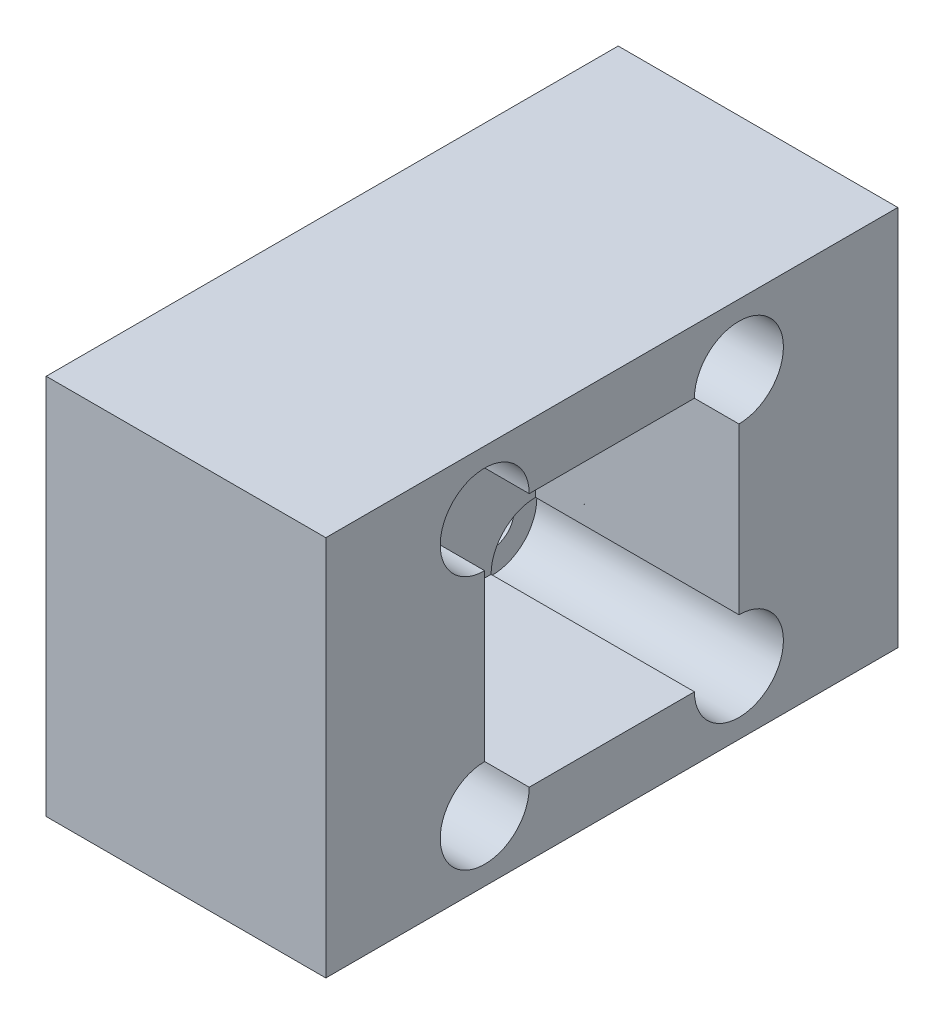
ISO-10303-21;
HEADER;
FILE_DESCRIPTION(('STEP AP214'),'2;1');
FILE_NAME('part.step','',(''),(''),'','','');
FILE_SCHEMA(('AUTOMOTIVE_DESIGN { 1 0 10303 214 1 1 1 1 }'));
ENDSEC;
DATA;
#1=APPLICATION_CONTEXT('core data for automotive mechanical design processes');
#2=APPLICATION_PROTOCOL_DEFINITION('international standard','automotive_design',2000,#1);
#3=PRODUCT_CONTEXT('',#1,'mechanical');
#4=PRODUCT('Part','Part','',(#3));
#5=PRODUCT_RELATED_PRODUCT_CATEGORY('part','',(#4));
#6=PRODUCT_DEFINITION_FORMATION('','',#4);
#7=PRODUCT_DEFINITION_CONTEXT('part definition',#1,'design');
#8=PRODUCT_DEFINITION('design','',#6,#7);
#9=PRODUCT_DEFINITION_SHAPE('','',#8);
#10=(LENGTH_UNIT() NAMED_UNIT(*) SI_UNIT(.MILLI.,.METRE.));
#11=(NAMED_UNIT(*) PLANE_ANGLE_UNIT() SI_UNIT($,.RADIAN.));
#12=(NAMED_UNIT(*) SI_UNIT($,.STERADIAN.) SOLID_ANGLE_UNIT());
#13=UNCERTAINTY_MEASURE_WITH_UNIT(LENGTH_MEASURE(1.E-05),#10,'distance_accuracy_value','');
#14=(GEOMETRIC_REPRESENTATION_CONTEXT(3) GLOBAL_UNCERTAINTY_ASSIGNED_CONTEXT((#13)) GLOBAL_UNIT_ASSIGNED_CONTEXT((#10,
#11,#12)) REPRESENTATION_CONTEXT('',''));
#15=CARTESIAN_POINT('',(0.,0.,0.));
#16=DIRECTION('',(0.,0.,1.));
#17=DIRECTION('',(1.,0.,0.));
#18=AXIS2_PLACEMENT_3D('',#15,#16,#17);
#19=CARTESIAN_POINT('',(22.,0.,0.));
#20=DIRECTION('',(-1.,0.,0.));
#21=DIRECTION('',(0.,0.,1.));
#22=AXIS2_PLACEMENT_3D('',#19,#20,#21);
#23=PLANE('',#22);
#24=DIRECTION('',(0.,-1.,0.));
#25=VECTOR('',#24,1.);
#26=CARTESIAN_POINT('',(22.,0.,0.));
#27=LINE('',#26,#25);
#28=CARTESIAN_POINT('',(22.,30.,0.));
#29=VERTEX_POINT('',#28);
#30=CARTESIAN_POINT('',(22.,0.,0.));
#31=VERTEX_POINT('',#30);
#32=EDGE_CURVE('E153',#29,#31,#27,.T.);
#33=ORIENTED_EDGE('',*,*,#32,.T.);
#34=DIRECTION('',(0.,0.,-1.));
#35=VECTOR('',#34,1.);
#36=CARTESIAN_POINT('',(22.,0.,0.));
#37=LINE('',#36,#35);
#38=CARTESIAN_POINT('',(22.,0.,-45.));
#39=VERTEX_POINT('',#38);
#40=EDGE_CURVE('E156',#31,#39,#37,.T.);
#41=ORIENTED_EDGE('',*,*,#40,.T.);
#42=DIRECTION('',(0.,1.,0.));
#43=VECTOR('',#42,1.);
#44=CARTESIAN_POINT('',(22.,0.,-45.));
#45=LINE('',#44,#43);
#46=CARTESIAN_POINT('',(22.,30.,-45.));
#47=VERTEX_POINT('',#46);
#48=EDGE_CURVE('E159',#39,#47,#45,.T.);
#49=ORIENTED_EDGE('',*,*,#48,.T.);
#50=DIRECTION('',(0.,0.,1.));
#51=VECTOR('',#50,1.);
#52=CARTESIAN_POINT('',(22.,30.,0.));
#53=LINE('',#52,#51);
#54=EDGE_CURVE('E161',#47,#29,#53,.T.);
#55=ORIENTED_EDGE('',*,*,#54,.T.);
#56=EDGE_LOOP('',(#33,#41,#49,#55));
#57=FACE_BOUND('',#56,.T.);
#58=CARTESIAN_POINT('',(22.,25.,-12.5));
#59=DIRECTION('',(1.,0.,0.));
#60=DIRECTION('',(0.,0.,-1.));
#61=AXIS2_PLACEMENT_3D('',#58,#59,#60);
#62=CIRCLE('',#61,3.5);
#63=CARTESIAN_POINT('',(22.,25.,-16.));
#64=VERTEX_POINT('',#63);
#65=CARTESIAN_POINT('',(22.,21.5,-12.5));
#66=VERTEX_POINT('',#65);
#67=EDGE_CURVE('E126',#64,#66,#62,.T.);
#68=ORIENTED_EDGE('',*,*,#67,.F.);
#69=DIRECTION('',(0.,0.,1.));
#70=VECTOR('',#69,1.);
#71=CARTESIAN_POINT('',(22.,25.,-12.5));
#72=LINE('',#71,#70);
#73=CARTESIAN_POINT('',(22.,25.,-29.));
#74=VERTEX_POINT('',#73);
#75=EDGE_CURVE('E137',#74,#64,#72,.T.);
#76=ORIENTED_EDGE('',*,*,#75,.F.);
#77=CARTESIAN_POINT('',(22.,25.,-32.5));
#78=DIRECTION('',(1.,0.,0.));
#79=DIRECTION('',(0.,0.,-1.));
#80=AXIS2_PLACEMENT_3D('',#77,#78,#79);
#81=CIRCLE('',#80,3.5);
#82=CARTESIAN_POINT('',(22.,21.5,-32.5));
#83=VERTEX_POINT('',#82);
#84=EDGE_CURVE('E470',#83,#74,#81,.T.);
#85=ORIENTED_EDGE('',*,*,#84,.F.);
#86=DIRECTION('',(0.,1.,0.));
#87=VECTOR('',#86,1.);
#88=CARTESIAN_POINT('',(22.,25.,-32.5));
#89=LINE('',#88,#87);
#90=CARTESIAN_POINT('',(22.,8.49999999999999,-32.5));
#91=VERTEX_POINT('',#90);
#92=EDGE_CURVE('E144',#91,#83,#89,.T.);
#93=ORIENTED_EDGE('',*,*,#92,.F.);
#94=CARTESIAN_POINT('',(22.,5.,-32.5));
#95=DIRECTION('',(1.,0.,0.));
#96=DIRECTION('',(0.,0.,-1.));
#97=AXIS2_PLACEMENT_3D('',#94,#95,#96);
#98=CIRCLE('',#97,3.5);
#99=CARTESIAN_POINT('',(22.,5.,-29.));
#100=VERTEX_POINT('',#99);
#101=EDGE_CURVE('E220',#100,#91,#98,.T.);
#102=ORIENTED_EDGE('',*,*,#101,.F.);
#103=DIRECTION('',(0.,0.,-1.));
#104=VECTOR('',#103,1.);
#105=CARTESIAN_POINT('',(22.,5.,-12.5));
#106=LINE('',#105,#104);
#107=CARTESIAN_POINT('',(22.,5.,-16.));
#108=VERTEX_POINT('',#107);
#109=EDGE_CURVE('E149',#108,#100,#106,.T.);
#110=ORIENTED_EDGE('',*,*,#109,.F.);
#111=CARTESIAN_POINT('',(22.,5.,-12.5));
#112=DIRECTION('',(1.,0.,0.));
#113=DIRECTION('',(0.,0.,-1.));
#114=AXIS2_PLACEMENT_3D('',#111,#112,#113);
#115=CIRCLE('',#114,3.5);
#116=CARTESIAN_POINT('',(22.,8.49999999999999,-12.5));
#117=VERTEX_POINT('',#116);
#118=EDGE_CURVE('E219',#117,#108,#115,.T.);
#119=ORIENTED_EDGE('',*,*,#118,.F.);
#120=DIRECTION('',(0.,-1.,0.));
#121=VECTOR('',#120,1.);
#122=CARTESIAN_POINT('',(22.,25.,-12.5));
#123=LINE('',#122,#121);
#124=EDGE_CURVE('E139',#66,#117,#123,.T.);
#125=ORIENTED_EDGE('',*,*,#124,.F.);
#126=EDGE_LOOP('',(#68,#76,#85,#93,#102,#110,#119,#125));
#127=FACE_BOUND('',#126,.T.);
#128=ADVANCED_FACE('F37',(#57,#127),#23,.F.);
#129=CARTESIAN_POINT('',(22.,0.,0.));
#130=DIRECTION('',(0.,0.,-1.));
#131=DIRECTION('',(0.,1.,0.));
#132=AXIS2_PLACEMENT_3D('',#129,#130,#131);
#133=PLANE('',#132);
#134=DIRECTION('',(0.,-1.,0.));
#135=VECTOR('',#134,1.);
#136=CARTESIAN_POINT('',(0.,0.,0.));
#137=LINE('',#136,#135);
#138=CARTESIAN_POINT('',(0.,30.,0.));
#139=VERTEX_POINT('',#138);
#140=CARTESIAN_POINT('',(0.,0.,0.));
#141=VERTEX_POINT('',#140);
#142=EDGE_CURVE('E164',#139,#141,#137,.T.);
#143=ORIENTED_EDGE('',*,*,#142,.T.);
#144=DIRECTION('',(-1.,0.,0.));
#145=VECTOR('',#144,1.);
#146=CARTESIAN_POINT('',(22.,0.,0.));
#147=LINE('',#146,#145);
#148=EDGE_CURVE('E181',#31,#141,#147,.T.);
#149=ORIENTED_EDGE('',*,*,#148,.F.);
#150=ORIENTED_EDGE('',*,*,#32,.F.);
#151=DIRECTION('',(-1.,0.,0.));
#152=VECTOR('',#151,1.);
#153=CARTESIAN_POINT('',(22.,30.,0.));
#154=LINE('',#153,#152);
#155=EDGE_CURVE('E163',#29,#139,#154,.T.);
#156=ORIENTED_EDGE('',*,*,#155,.T.);
#157=EDGE_LOOP('',(#143,#149,#150,#156));
#158=FACE_BOUND('',#157,.T.);
#159=ADVANCED_FACE('F39',(#158),#133,.F.);
#160=CARTESIAN_POINT('',(22.,0.,0.));
#161=DIRECTION('',(0.,1.,0.));
#162=DIRECTION('',(0.,0.,1.));
#163=AXIS2_PLACEMENT_3D('',#160,#161,#162);
#164=PLANE('',#163);
#165=DIRECTION('',(0.,0.,-1.));
#166=VECTOR('',#165,1.);
#167=CARTESIAN_POINT('',(0.,0.,0.));
#168=LINE('',#167,#166);
#169=CARTESIAN_POINT('',(0.,0.,-45.));
#170=VERTEX_POINT('',#169);
#171=EDGE_CURVE('E167',#141,#170,#168,.T.);
#172=ORIENTED_EDGE('',*,*,#171,.T.);
#173=DIRECTION('',(-1.,0.,0.));
#174=VECTOR('',#173,1.);
#175=CARTESIAN_POINT('',(22.,0.,-45.));
#176=LINE('',#175,#174);
#177=EDGE_CURVE('E178',#39,#170,#176,.T.);
#178=ORIENTED_EDGE('',*,*,#177,.F.);
#179=ORIENTED_EDGE('',*,*,#40,.F.);
#180=ORIENTED_EDGE('',*,*,#148,.T.);
#181=EDGE_LOOP('',(#172,#178,#179,#180));
#182=FACE_BOUND('',#181,.T.);
#183=ADVANCED_FACE('F277',(#182),#164,.F.);
#184=CARTESIAN_POINT('',(22.,0.,-45.));
#185=DIRECTION('',(0.,0.,1.));
#186=DIRECTION('',(0.,-1.,0.));
#187=AXIS2_PLACEMENT_3D('',#184,#185,#186);
#188=PLANE('',#187);
#189=DIRECTION('',(0.,1.,0.));
#190=VECTOR('',#189,1.);
#191=CARTESIAN_POINT('',(0.,0.,-45.));
#192=LINE('',#191,#190);
#193=CARTESIAN_POINT('',(0.,30.,-45.));
#194=VERTEX_POINT('',#193);
#195=EDGE_CURVE('E170',#170,#194,#192,.T.);
#196=ORIENTED_EDGE('',*,*,#195,.T.);
#197=DIRECTION('',(-1.,0.,0.));
#198=VECTOR('',#197,1.);
#199=CARTESIAN_POINT('',(22.,30.,-45.));
#200=LINE('',#199,#198);
#201=EDGE_CURVE('E175',#47,#194,#200,.T.);
#202=ORIENTED_EDGE('',*,*,#201,.F.);
#203=ORIENTED_EDGE('',*,*,#48,.F.);
#204=ORIENTED_EDGE('',*,*,#177,.T.);
#205=EDGE_LOOP('',(#196,#202,#203,#204));
#206=FACE_BOUND('',#205,.T.);
#207=ADVANCED_FACE('F289',(#206),#188,.F.);
#208=CARTESIAN_POINT('',(22.,30.,0.));
#209=DIRECTION('',(0.,-1.,0.));
#210=DIRECTION('',(0.,0.,-1.));
#211=AXIS2_PLACEMENT_3D('',#208,#209,#210);
#212=PLANE('',#211);
#213=DIRECTION('',(0.,0.,1.));
#214=VECTOR('',#213,1.);
#215=CARTESIAN_POINT('',(0.,30.,0.));
#216=LINE('',#215,#214);
#217=EDGE_CURVE('E157',#194,#139,#216,.T.);
#218=ORIENTED_EDGE('',*,*,#217,.T.);
#219=ORIENTED_EDGE('',*,*,#155,.F.);
#220=ORIENTED_EDGE('',*,*,#54,.F.);
#221=ORIENTED_EDGE('',*,*,#201,.T.);
#222=EDGE_LOOP('',(#218,#219,#220,#221));
#223=FACE_BOUND('',#222,.T.);
#224=ADVANCED_FACE('F285',(#223),#212,.F.);
#225=CARTESIAN_POINT('',(0.,0.,0.));
#226=DIRECTION('',(-1.,0.,0.));
#227=DIRECTION('',(0.,0.,1.));
#228=AXIS2_PLACEMENT_3D('',#225,#226,#227);
#229=PLANE('',#228);
#230=CARTESIAN_POINT('',(0.,25.,-12.5));
#231=DIRECTION('',(1.,0.,0.));
#232=DIRECTION('',(0.,0.,-1.));
#233=AXIS2_PLACEMENT_3D('',#230,#231,#232);
#234=CIRCLE('',#233,1.69999999999999);
#235=CARTESIAN_POINT('',(0.,25.,-14.2));
#236=VERTEX_POINT('',#235);
#237=EDGE_CURVE('E131',#236,#236,#234,.T.);
#238=ORIENTED_EDGE('',*,*,#237,.T.);
#239=EDGE_LOOP('',(#238));
#240=FACE_BOUND('',#239,.T.);
#241=CARTESIAN_POINT('',(0.,25.,-32.5));
#242=DIRECTION('',(1.,0.,0.));
#243=DIRECTION('',(0.,0.,-1.));
#244=AXIS2_PLACEMENT_3D('',#241,#242,#243);
#245=CIRCLE('',#244,1.69999999999999);
#246=CARTESIAN_POINT('',(0.,25.,-34.2));
#247=VERTEX_POINT('',#246);
#248=EDGE_CURVE('E199',#247,#247,#245,.T.);
#249=ORIENTED_EDGE('',*,*,#248,.T.);
#250=EDGE_LOOP('',(#249));
#251=FACE_BOUND('',#250,.T.);
#252=CARTESIAN_POINT('',(0.,5.,-32.5));
#253=DIRECTION('',(1.,0.,0.));
#254=DIRECTION('',(0.,0.,-1.));
#255=AXIS2_PLACEMENT_3D('',#252,#253,#254);
#256=CIRCLE('',#255,1.69999999999999);
#257=CARTESIAN_POINT('',(0.,5.,-34.2));
#258=VERTEX_POINT('',#257);
#259=EDGE_CURVE('E231',#258,#258,#256,.T.);
#260=ORIENTED_EDGE('',*,*,#259,.T.);
#261=EDGE_LOOP('',(#260));
#262=FACE_BOUND('',#261,.T.);
#263=CARTESIAN_POINT('',(0.,5.,-12.5));
#264=DIRECTION('',(1.,0.,0.));
#265=DIRECTION('',(0.,0.,-1.));
#266=AXIS2_PLACEMENT_3D('',#263,#264,#265);
#267=CIRCLE('',#266,1.69999999999999);
#268=CARTESIAN_POINT('',(0.,5.,-14.2));
#269=VERTEX_POINT('',#268);
#270=EDGE_CURVE('E244',#269,#269,#267,.T.);
#271=ORIENTED_EDGE('',*,*,#270,.T.);
#272=EDGE_LOOP('',(#271));
#273=FACE_BOUND('',#272,.T.);
#274=ORIENTED_EDGE('',*,*,#142,.F.);
#275=ORIENTED_EDGE('',*,*,#217,.F.);
#276=ORIENTED_EDGE('',*,*,#195,.F.);
#277=ORIENTED_EDGE('',*,*,#171,.F.);
#278=EDGE_LOOP('',(#274,#275,#276,#277));
#279=FACE_BOUND('',#278,.T.);
#280=ADVANCED_FACE('F282',(#240,#251,#262,#273,#279),#229,.T.);
#281=CARTESIAN_POINT('',(6.,25.,-12.5));
#282=DIRECTION('',(0.,0.,1.));
#283=DIRECTION('',(0.,-1.,0.));
#284=AXIS2_PLACEMENT_3D('',#281,#282,#283);
#285=PLANE('',#284);
#286=DIRECTION('',(0.,-1.,0.));
#287=VECTOR('',#286,1.);
#288=CARTESIAN_POINT('',(6.,25.,-12.5));
#289=LINE('',#288,#287);
#290=CARTESIAN_POINT('',(6.,21.5,-12.5));
#291=VERTEX_POINT('',#290);
#292=CARTESIAN_POINT('',(6.,8.49999999999999,-12.5));
#293=VERTEX_POINT('',#292);
#294=EDGE_CURVE('E143',#291,#293,#289,.T.);
#295=ORIENTED_EDGE('',*,*,#294,.F.);
#296=DIRECTION('',(1.,0.,0.));
#297=VECTOR('',#296,1.);
#298=CARTESIAN_POINT('',(22.,21.5,-12.5));
#299=LINE('',#298,#297);
#300=EDGE_CURVE('E51',#291,#66,#299,.T.);
#301=ORIENTED_EDGE('',*,*,#300,.T.);
#302=ORIENTED_EDGE('',*,*,#124,.T.);
#303=DIRECTION('',(1.,0.,0.));
#304=VECTOR('',#303,1.);
#305=CARTESIAN_POINT('',(22.,8.49999999999999,-12.5));
#306=LINE('',#305,#304);
#307=EDGE_CURVE('E208',#117,#293,#306,.F.);
#308=ORIENTED_EDGE('',*,*,#307,.T.);
#309=EDGE_LOOP('',(#295,#301,#302,#308));
#310=FACE_BOUND('',#309,.T.);
#311=ADVANCED_FACE('F252',(#310),#285,.F.);
#312=CARTESIAN_POINT('',(6.,25.,-12.5));
#313=DIRECTION('',(0.,1.,0.));
#314=DIRECTION('',(0.,0.,1.));
#315=AXIS2_PLACEMENT_3D('',#312,#313,#314);
#316=PLANE('',#315);
#317=ORIENTED_EDGE('',*,*,#75,.T.);
#318=DIRECTION('',(1.,0.,0.));
#319=VECTOR('',#318,1.);
#320=CARTESIAN_POINT('',(22.,25.,-16.));
#321=LINE('',#320,#319);
#322=CARTESIAN_POINT('',(6.,25.,-16.));
#323=VERTEX_POINT('',#322);
#324=EDGE_CURVE('E123',#64,#323,#321,.F.);
#325=ORIENTED_EDGE('',*,*,#324,.T.);
#326=DIRECTION('',(0.,0.,1.));
#327=VECTOR('',#326,1.);
#328=CARTESIAN_POINT('',(6.,25.,-12.5));
#329=LINE('',#328,#327);
#330=CARTESIAN_POINT('',(6.,25.,-29.));
#331=VERTEX_POINT('',#330);
#332=EDGE_CURVE('E168',#331,#323,#329,.T.);
#333=ORIENTED_EDGE('',*,*,#332,.F.);
#334=DIRECTION('',(1.,0.,0.));
#335=VECTOR('',#334,1.);
#336=CARTESIAN_POINT('',(22.,25.,-29.));
#337=LINE('',#336,#335);
#338=EDGE_CURVE('E59',#331,#74,#337,.T.);
#339=ORIENTED_EDGE('',*,*,#338,.T.);
#340=EDGE_LOOP('',(#317,#325,#333,#339));
#341=FACE_BOUND('',#340,.T.);
#342=ADVANCED_FACE('F142',(#341),#316,.F.);
#343=CARTESIAN_POINT('',(6.,25.,-32.5));
#344=DIRECTION('',(0.,0.,-1.));
#345=DIRECTION('',(0.,1.,0.));
#346=AXIS2_PLACEMENT_3D('',#343,#344,#345);
#347=PLANE('',#346);
#348=ORIENTED_EDGE('',*,*,#92,.T.);
#349=DIRECTION('',(1.,0.,0.));
#350=VECTOR('',#349,1.);
#351=CARTESIAN_POINT('',(22.,21.5,-32.5));
#352=LINE('',#351,#350);
#353=CARTESIAN_POINT('',(6.,21.5,-32.5));
#354=VERTEX_POINT('',#353);
#355=EDGE_CURVE('E190',#83,#354,#352,.F.);
#356=ORIENTED_EDGE('',*,*,#355,.T.);
#357=DIRECTION('',(0.,1.,0.));
#358=VECTOR('',#357,1.);
#359=CARTESIAN_POINT('',(6.,25.,-32.5));
#360=LINE('',#359,#358);
#361=CARTESIAN_POINT('',(6.,8.49999999999999,-32.5));
#362=VERTEX_POINT('',#361);
#363=EDGE_CURVE('E197',#362,#354,#360,.T.);
#364=ORIENTED_EDGE('',*,*,#363,.F.);
#365=DIRECTION('',(1.,0.,0.));
#366=VECTOR('',#365,1.);
#367=CARTESIAN_POINT('',(22.,8.49999999999999,-32.5));
#368=LINE('',#367,#366);
#369=EDGE_CURVE('E235',#362,#91,#368,.T.);
#370=ORIENTED_EDGE('',*,*,#369,.T.);
#371=EDGE_LOOP('',(#348,#356,#364,#370));
#372=FACE_BOUND('',#371,.T.);
#373=ADVANCED_FACE('F195',(#372),#347,.F.);
#374=CARTESIAN_POINT('',(6.,5.,-12.5));
#375=DIRECTION('',(0.,-1.,0.));
#376=DIRECTION('',(0.,0.,-1.));
#377=AXIS2_PLACEMENT_3D('',#374,#375,#376);
#378=PLANE('',#377);
#379=ORIENTED_EDGE('',*,*,#109,.T.);
#380=DIRECTION('',(1.,0.,0.));
#381=VECTOR('',#380,1.);
#382=CARTESIAN_POINT('',(22.,5.,-29.));
#383=LINE('',#382,#381);
#384=CARTESIAN_POINT('',(6.,5.,-29.));
#385=VERTEX_POINT('',#384);
#386=EDGE_CURVE('E216',#100,#385,#383,.F.);
#387=ORIENTED_EDGE('',*,*,#386,.T.);
#388=DIRECTION('',(0.,0.,-1.));
#389=VECTOR('',#388,1.);
#390=CARTESIAN_POINT('',(6.,5.,-12.5));
#391=LINE('',#390,#389);
#392=CARTESIAN_POINT('',(6.,5.,-16.));
#393=VERTEX_POINT('',#392);
#394=EDGE_CURVE('E146',#393,#385,#391,.T.);
#395=ORIENTED_EDGE('',*,*,#394,.F.);
#396=DIRECTION('',(1.,0.,0.));
#397=VECTOR('',#396,1.);
#398=CARTESIAN_POINT('',(22.,5.,-16.));
#399=LINE('',#398,#397);
#400=EDGE_CURVE('E217',#393,#108,#399,.T.);
#401=ORIENTED_EDGE('',*,*,#400,.T.);
#402=EDGE_LOOP('',(#379,#387,#395,#401));
#403=FACE_BOUND('',#402,.T.);
#404=ADVANCED_FACE('F214',(#403),#378,.F.);
#405=CARTESIAN_POINT('',(6.,0.,0.));
#406=DIRECTION('',(1.,0.,0.));
#407=DIRECTION('',(0.,0.,-1.));
#408=AXIS2_PLACEMENT_3D('',#405,#406,#407);
#409=PLANE('',#408);
#410=CARTESIAN_POINT('',(6.,25.,-12.5));
#411=DIRECTION('',(1.,0.,0.));
#412=DIRECTION('',(0.,0.,-1.));
#413=AXIS2_PLACEMENT_3D('',#410,#411,#412);
#414=CIRCLE('',#413,3.5);
#415=EDGE_CURVE('E11',#291,#323,#414,.T.);
#416=ORIENTED_EDGE('',*,*,#415,.F.);
#417=ORIENTED_EDGE('',*,*,#294,.T.);
#418=CARTESIAN_POINT('',(6.,5.,-12.5));
#419=DIRECTION('',(1.,0.,0.));
#420=DIRECTION('',(0.,0.,-1.));
#421=AXIS2_PLACEMENT_3D('',#418,#419,#420);
#422=CIRCLE('',#421,3.5);
#423=EDGE_CURVE('E184',#393,#293,#422,.T.);
#424=ORIENTED_EDGE('',*,*,#423,.F.);
#425=ORIENTED_EDGE('',*,*,#394,.T.);
#426=CARTESIAN_POINT('',(6.,5.,-32.5));
#427=DIRECTION('',(1.,0.,0.));
#428=DIRECTION('',(0.,0.,-1.));
#429=AXIS2_PLACEMENT_3D('',#426,#427,#428);
#430=CIRCLE('',#429,3.5);
#431=EDGE_CURVE('E187',#362,#385,#430,.T.);
#432=ORIENTED_EDGE('',*,*,#431,.F.);
#433=ORIENTED_EDGE('',*,*,#363,.T.);
#434=CARTESIAN_POINT('',(6.,25.,-32.5));
#435=DIRECTION('',(1.,0.,0.));
#436=DIRECTION('',(0.,0.,-1.));
#437=AXIS2_PLACEMENT_3D('',#434,#435,#436);
#438=CIRCLE('',#437,3.5);
#439=EDGE_CURVE('E45',#331,#354,#438,.T.);
#440=ORIENTED_EDGE('',*,*,#439,.F.);
#441=ORIENTED_EDGE('',*,*,#332,.T.);
#442=EDGE_LOOP('',(#416,#417,#424,#425,#432,#433,#440,#441));
#443=FACE_BOUND('',#442,.T.);
#444=ADVANCED_FACE('F202',(#443),#409,.T.);
#445=CARTESIAN_POINT('',(22.,5.,-12.5));
#446=DIRECTION('',(1.,0.,0.));
#447=DIRECTION('',(0.,0.,-1.));
#448=AXIS2_PLACEMENT_3D('',#445,#446,#447);
#449=CYLINDRICAL_SURFACE('',#448,3.5);
#450=CARTESIAN_POINT('',(2.6,5.,-12.5));
#451=DIRECTION('',(1.,0.,0.));
#452=DIRECTION('',(0.,0.,-1.));
#453=AXIS2_PLACEMENT_3D('',#450,#451,#452);
#454=CIRCLE('',#453,3.5);
#455=CARTESIAN_POINT('',(2.6,5.,-16.));
#456=VERTEX_POINT('',#455);
#457=EDGE_CURVE('E238',#456,#456,#454,.T.);
#458=ORIENTED_EDGE('',*,*,#457,.F.);
#459=EDGE_LOOP('',(#458));
#460=FACE_BOUND('',#459,.T.);
#461=ORIENTED_EDGE('',*,*,#118,.T.);
#462=ORIENTED_EDGE('',*,*,#400,.F.);
#463=ORIENTED_EDGE('',*,*,#423,.T.);
#464=ORIENTED_EDGE('',*,*,#307,.F.);
#465=EDGE_LOOP('',(#461,#462,#463,#464));
#466=FACE_BOUND('',#465,.T.);
#467=ADVANCED_FACE('F254',(#460,#466),#449,.F.);
#468=CARTESIAN_POINT('',(22.,5.,-12.5));
#469=DIRECTION('',(1.,0.,0.));
#470=DIRECTION('',(0.,0.,-1.));
#471=AXIS2_PLACEMENT_3D('',#468,#469,#470);
#472=CYLINDRICAL_SURFACE('',#471,1.69999999999999);
#473=ORIENTED_EDGE('',*,*,#270,.F.);
#474=EDGE_LOOP('',(#473));
#475=FACE_BOUND('',#474,.T.);
#476=CARTESIAN_POINT('',(2.6,5.,-12.5));
#477=DIRECTION('',(1.,0.,0.));
#478=DIRECTION('',(0.,0.,-1.));
#479=AXIS2_PLACEMENT_3D('',#476,#477,#478);
#480=CIRCLE('',#479,1.7);
#481=CARTESIAN_POINT('',(2.6,5.,-14.2));
#482=VERTEX_POINT('',#481);
#483=EDGE_CURVE('E241',#482,#482,#480,.T.);
#484=ORIENTED_EDGE('',*,*,#483,.T.);
#485=EDGE_LOOP('',(#484));
#486=FACE_BOUND('',#485,.T.);
#487=ADVANCED_FACE('F257',(#475,#486),#472,.F.);
#488=CARTESIAN_POINT('',(2.6,6.69999999999999,-12.5));
#489=DIRECTION('',(-1.,0.,0.));
#490=DIRECTION('',(0.,0.,1.));
#491=AXIS2_PLACEMENT_3D('',#488,#489,#490);
#492=PLANE('',#491);
#493=ORIENTED_EDGE('',*,*,#483,.F.);
#494=EDGE_LOOP('',(#493));
#495=FACE_BOUND('',#494,.T.);
#496=ORIENTED_EDGE('',*,*,#457,.T.);
#497=EDGE_LOOP('',(#496));
#498=FACE_BOUND('',#497,.T.);
#499=ADVANCED_FACE('F264',(#495,#498),#492,.F.);
#500=CARTESIAN_POINT('',(22.,5.,-32.5));
#501=DIRECTION('',(1.,0.,0.));
#502=DIRECTION('',(0.,0.,-1.));
#503=AXIS2_PLACEMENT_3D('',#500,#501,#502);
#504=CYLINDRICAL_SURFACE('',#503,3.5);
#505=CARTESIAN_POINT('',(2.6,5.,-32.5));
#506=DIRECTION('',(1.,0.,0.));
#507=DIRECTION('',(0.,0.,-1.));
#508=AXIS2_PLACEMENT_3D('',#505,#506,#507);
#509=CIRCLE('',#508,3.5);
#510=CARTESIAN_POINT('',(2.6,5.,-36.));
#511=VERTEX_POINT('',#510);
#512=EDGE_CURVE('E222',#511,#511,#509,.T.);
#513=ORIENTED_EDGE('',*,*,#512,.F.);
#514=EDGE_LOOP('',(#513));
#515=FACE_BOUND('',#514,.T.);
#516=ORIENTED_EDGE('',*,*,#431,.T.);
#517=ORIENTED_EDGE('',*,*,#386,.F.);
#518=ORIENTED_EDGE('',*,*,#101,.T.);
#519=ORIENTED_EDGE('',*,*,#369,.F.);
#520=EDGE_LOOP('',(#516,#517,#518,#519));
#521=FACE_BOUND('',#520,.T.);
#522=ADVANCED_FACE('F368',(#515,#521),#504,.F.);
#523=CARTESIAN_POINT('',(22.,5.,-32.5));
#524=DIRECTION('',(1.,0.,0.));
#525=DIRECTION('',(0.,0.,-1.));
#526=AXIS2_PLACEMENT_3D('',#523,#524,#525);
#527=CYLINDRICAL_SURFACE('',#526,1.69999999999999);
#528=ORIENTED_EDGE('',*,*,#259,.F.);
#529=EDGE_LOOP('',(#528));
#530=FACE_BOUND('',#529,.T.);
#531=CARTESIAN_POINT('',(2.6,5.,-32.5));
#532=DIRECTION('',(1.,0.,0.));
#533=DIRECTION('',(0.,0.,-1.));
#534=AXIS2_PLACEMENT_3D('',#531,#532,#533);
#535=CIRCLE('',#534,1.69999999999999);
#536=CARTESIAN_POINT('',(2.6,5.,-34.2));
#537=VERTEX_POINT('',#536);
#538=EDGE_CURVE('E225',#537,#537,#535,.T.);
#539=ORIENTED_EDGE('',*,*,#538,.T.);
#540=EDGE_LOOP('',(#539));
#541=FACE_BOUND('',#540,.T.);
#542=ADVANCED_FACE('F377',(#530,#541),#527,.F.);
#543=CARTESIAN_POINT('',(2.6,6.69999999999999,-32.5));
#544=DIRECTION('',(-1.,0.,0.));
#545=DIRECTION('',(0.,0.,1.));
#546=AXIS2_PLACEMENT_3D('',#543,#544,#545);
#547=PLANE('',#546);
#548=ORIENTED_EDGE('',*,*,#538,.F.);
#549=EDGE_LOOP('',(#548));
#550=FACE_BOUND('',#549,.T.);
#551=ORIENTED_EDGE('',*,*,#512,.T.);
#552=EDGE_LOOP('',(#551));
#553=FACE_BOUND('',#552,.T.);
#554=ADVANCED_FACE('F387',(#550,#553),#547,.F.);
#555=CARTESIAN_POINT('',(22.,25.,-32.5));
#556=DIRECTION('',(1.,0.,0.));
#557=DIRECTION('',(0.,0.,-1.));
#558=AXIS2_PLACEMENT_3D('',#555,#556,#557);
#559=CYLINDRICAL_SURFACE('',#558,3.5);
#560=CARTESIAN_POINT('',(2.6,25.,-32.5));
#561=DIRECTION('',(1.,0.,0.));
#562=DIRECTION('',(0.,0.,-1.));
#563=AXIS2_PLACEMENT_3D('',#560,#561,#562);
#564=CIRCLE('',#563,3.5);
#565=CARTESIAN_POINT('',(2.6,25.,-36.));
#566=VERTEX_POINT('',#565);
#567=EDGE_CURVE('E472',#566,#566,#564,.T.);
#568=ORIENTED_EDGE('',*,*,#567,.F.);
#569=EDGE_LOOP('',(#568));
#570=FACE_BOUND('',#569,.T.);
#571=ORIENTED_EDGE('',*,*,#439,.T.);
#572=ORIENTED_EDGE('',*,*,#355,.F.);
#573=ORIENTED_EDGE('',*,*,#84,.T.);
#574=ORIENTED_EDGE('',*,*,#338,.F.);
#575=EDGE_LOOP('',(#571,#572,#573,#574));
#576=FACE_BOUND('',#575,.T.);
#577=ADVANCED_FACE('F189',(#570,#576),#559,.F.);
#578=CARTESIAN_POINT('',(22.,25.,-32.5));
#579=DIRECTION('',(1.,0.,0.));
#580=DIRECTION('',(0.,0.,-1.));
#581=AXIS2_PLACEMENT_3D('',#578,#579,#580);
#582=CYLINDRICAL_SURFACE('',#581,1.69999999999999);
#583=ORIENTED_EDGE('',*,*,#248,.F.);
#584=EDGE_LOOP('',(#583));
#585=FACE_BOUND('',#584,.T.);
#586=CARTESIAN_POINT('',(2.6,25.,-32.5));
#587=DIRECTION('',(1.,0.,0.));
#588=DIRECTION('',(0.,0.,-1.));
#589=AXIS2_PLACEMENT_3D('',#586,#587,#588);
#590=CIRCLE('',#589,1.7);
#591=CARTESIAN_POINT('',(2.6,25.,-34.2));
#592=VERTEX_POINT('',#591);
#593=EDGE_CURVE('E475',#592,#592,#590,.T.);
#594=ORIENTED_EDGE('',*,*,#593,.T.);
#595=EDGE_LOOP('',(#594));
#596=FACE_BOUND('',#595,.T.);
#597=ADVANCED_FACE('F405',(#585,#596),#582,.F.);
#598=CARTESIAN_POINT('',(2.6,26.7,-32.5));
#599=DIRECTION('',(-1.,0.,0.));
#600=DIRECTION('',(0.,0.,1.));
#601=AXIS2_PLACEMENT_3D('',#598,#599,#600);
#602=PLANE('',#601);
#603=ORIENTED_EDGE('',*,*,#593,.F.);
#604=EDGE_LOOP('',(#603));
#605=FACE_BOUND('',#604,.T.);
#606=ORIENTED_EDGE('',*,*,#567,.T.);
#607=EDGE_LOOP('',(#606));
#608=FACE_BOUND('',#607,.T.);
#609=ADVANCED_FACE('F415',(#605,#608),#602,.F.);
#610=CARTESIAN_POINT('',(22.,25.,-12.5));
#611=DIRECTION('',(1.,0.,0.));
#612=DIRECTION('',(0.,0.,-1.));
#613=AXIS2_PLACEMENT_3D('',#610,#611,#612);
#614=CYLINDRICAL_SURFACE('',#613,3.5);
#615=CARTESIAN_POINT('',(2.6,25.,-12.5));
#616=DIRECTION('',(1.,0.,0.));
#617=DIRECTION('',(0.,0.,-1.));
#618=AXIS2_PLACEMENT_3D('',#615,#616,#617);
#619=CIRCLE('',#618,3.5);
#620=CARTESIAN_POINT('',(2.6,25.,-16.));
#621=VERTEX_POINT('',#620);
#622=EDGE_CURVE('E140',#621,#621,#619,.T.);
#623=ORIENTED_EDGE('',*,*,#622,.F.);
#624=EDGE_LOOP('',(#623));
#625=FACE_BOUND('',#624,.T.);
#626=ORIENTED_EDGE('',*,*,#415,.T.);
#627=ORIENTED_EDGE('',*,*,#324,.F.);
#628=ORIENTED_EDGE('',*,*,#67,.T.);
#629=ORIENTED_EDGE('',*,*,#300,.F.);
#630=EDGE_LOOP('',(#626,#627,#628,#629));
#631=FACE_BOUND('',#630,.T.);
#632=ADVANCED_FACE('F125',(#625,#631),#614,.F.);
#633=CARTESIAN_POINT('',(22.,25.,-12.5));
#634=DIRECTION('',(1.,0.,0.));
#635=DIRECTION('',(0.,0.,-1.));
#636=AXIS2_PLACEMENT_3D('',#633,#634,#635);
#637=CYLINDRICAL_SURFACE('',#636,1.69999999999999);
#638=ORIENTED_EDGE('',*,*,#237,.F.);
#639=EDGE_LOOP('',(#638));
#640=FACE_BOUND('',#639,.T.);
#641=CARTESIAN_POINT('',(2.6,25.,-12.5));
#642=DIRECTION('',(1.,0.,0.));
#643=DIRECTION('',(0.,0.,-1.));
#644=AXIS2_PLACEMENT_3D('',#641,#642,#643);
#645=CIRCLE('',#644,1.7);
#646=CARTESIAN_POINT('',(2.6,25.,-14.2));
#647=VERTEX_POINT('',#646);
#648=EDGE_CURVE('E461',#647,#647,#645,.T.);
#649=ORIENTED_EDGE('',*,*,#648,.T.);
#650=EDGE_LOOP('',(#649));
#651=FACE_BOUND('',#650,.T.);
#652=ADVANCED_FACE('F434',(#640,#651),#637,.F.);
#653=CARTESIAN_POINT('',(2.6,26.7,-12.5));
#654=DIRECTION('',(-1.,0.,0.));
#655=DIRECTION('',(0.,0.,1.));
#656=AXIS2_PLACEMENT_3D('',#653,#654,#655);
#657=PLANE('',#656);
#658=ORIENTED_EDGE('',*,*,#648,.F.);
#659=EDGE_LOOP('',(#658));
#660=FACE_BOUND('',#659,.T.);
#661=ORIENTED_EDGE('',*,*,#622,.T.);
#662=EDGE_LOOP('',(#661));
#663=FACE_BOUND('',#662,.T.);
#664=ADVANCED_FACE('F444',(#660,#663),#657,.F.);
#665=CLOSED_SHELL('',(#128,#159,#183,#207,#224,#280,#311,#342,#373,#404,#444,#467,#487,#499,
#522,#542,#554,#577,#597,#609,#632,#652,#664));
#666=MANIFOLD_SOLID_BREP('B2',#665);
#667=ADVANCED_BREP_SHAPE_REPRESENTATION('',(#18,#666),#14);
#668=SHAPE_DEFINITION_REPRESENTATION(#9,#667);
ENDSEC;
END-ISO-10303-21;
